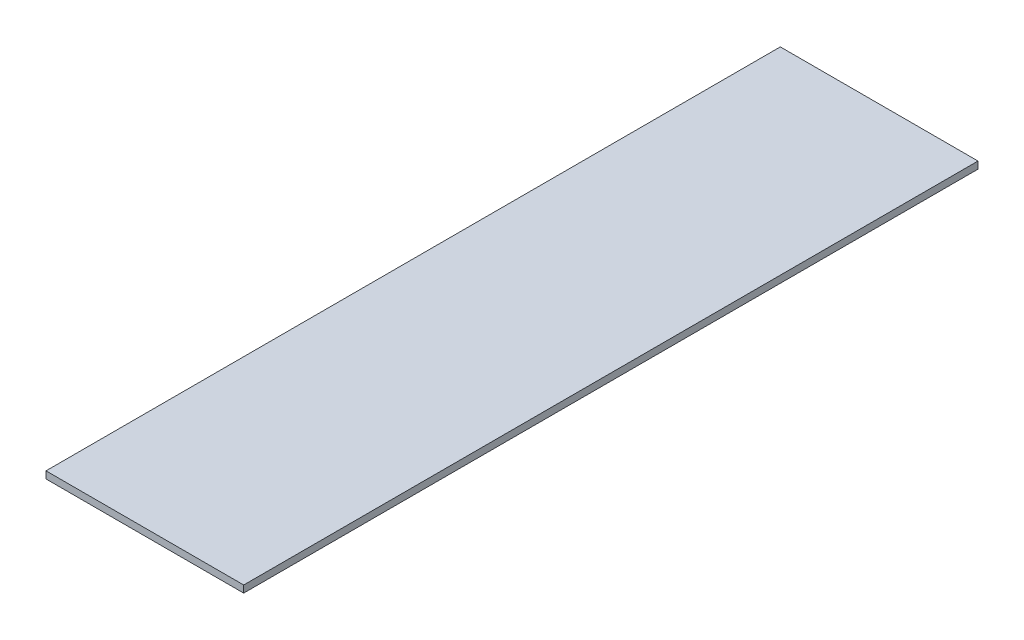
ISO-10303-21;
HEADER;
FILE_DESCRIPTION(('STEP AP214'),'2;1');
FILE_NAME('part.step','',(''),(''),'','','');
FILE_SCHEMA(('AUTOMOTIVE_DESIGN { 1 0 10303 214 1 1 1 1 }'));
ENDSEC;
DATA;
#1=APPLICATION_CONTEXT('core data for automotive mechanical design processes');
#2=APPLICATION_PROTOCOL_DEFINITION('international standard','automotive_design',2000,#1);
#3=PRODUCT_CONTEXT('',#1,'mechanical');
#4=PRODUCT('Part','Part','',(#3));
#5=PRODUCT_RELATED_PRODUCT_CATEGORY('part','',(#4));
#6=PRODUCT_DEFINITION_FORMATION('','',#4);
#7=PRODUCT_DEFINITION_CONTEXT('part definition',#1,'design');
#8=PRODUCT_DEFINITION('design','',#6,#7);
#9=PRODUCT_DEFINITION_SHAPE('','',#8);
#10=(LENGTH_UNIT() NAMED_UNIT(*) SI_UNIT(.MILLI.,.METRE.));
#11=(NAMED_UNIT(*) PLANE_ANGLE_UNIT() SI_UNIT($,.RADIAN.));
#12=(NAMED_UNIT(*) SI_UNIT($,.STERADIAN.) SOLID_ANGLE_UNIT());
#13=UNCERTAINTY_MEASURE_WITH_UNIT(LENGTH_MEASURE(1.E-05),#10,'distance_accuracy_value','');
#14=(GEOMETRIC_REPRESENTATION_CONTEXT(3) GLOBAL_UNCERTAINTY_ASSIGNED_CONTEXT((#13)) GLOBAL_UNIT_ASSIGNED_CONTEXT((#10,
#11,#12)) REPRESENTATION_CONTEXT('',''));
#15=CARTESIAN_POINT('',(0.,0.,0.));
#16=DIRECTION('',(0.,0.,1.));
#17=DIRECTION('',(1.,0.,0.));
#18=AXIS2_PLACEMENT_3D('',#15,#16,#17);
#19=CARTESIAN_POINT('',(-88.9,6.35,-330.2));
#20=DIRECTION('',(1.,0.,0.));
#21=DIRECTION('',(0.,0.,-1.));
#22=AXIS2_PLACEMENT_3D('',#19,#20,#21);
#23=PLANE('',#22);
#24=DIRECTION('',(0.,0.,1.));
#25=VECTOR('',#24,1.);
#26=CARTESIAN_POINT('',(-88.9,0.,-330.2));
#27=LINE('',#26,#25);
#28=CARTESIAN_POINT('',(-88.9,0.,-330.2));
#29=VERTEX_POINT('',#28);
#30=CARTESIAN_POINT('',(-88.8999999999999,0.,330.2));
#31=VERTEX_POINT('',#30);
#32=EDGE_CURVE('E96',#29,#31,#27,.T.);
#33=ORIENTED_EDGE('',*,*,#32,.T.);
#34=DIRECTION('',(0.,-1.,0.));
#35=VECTOR('',#34,1.);
#36=CARTESIAN_POINT('',(-88.8999999999999,6.35,330.2));
#37=LINE('',#36,#35);
#38=CARTESIAN_POINT('',(-88.8999999999999,6.35,330.2));
#39=VERTEX_POINT('',#38);
#40=EDGE_CURVE('E11',#39,#31,#37,.T.);
#41=ORIENTED_EDGE('',*,*,#40,.F.);
#42=DIRECTION('',(0.,0.,1.));
#43=VECTOR('',#42,1.);
#44=CARTESIAN_POINT('',(-88.9,6.35,-330.2));
#45=LINE('',#44,#43);
#46=CARTESIAN_POINT('',(-88.9,6.35,-330.2));
#47=VERTEX_POINT('',#46);
#48=EDGE_CURVE('E84',#47,#39,#45,.T.);
#49=ORIENTED_EDGE('',*,*,#48,.F.);
#50=DIRECTION('',(0.,-1.,0.));
#51=VECTOR('',#50,1.);
#52=CARTESIAN_POINT('',(-88.9,6.35,-330.2));
#53=LINE('',#52,#51);
#54=EDGE_CURVE('E92',#47,#29,#53,.T.);
#55=ORIENTED_EDGE('',*,*,#54,.T.);
#56=EDGE_LOOP('',(#33,#41,#49,#55));
#57=FACE_BOUND('',#56,.T.);
#58=ADVANCED_FACE('F33',(#57),#23,.F.);
#59=CARTESIAN_POINT('',(-88.8999999999999,6.35,330.2));
#60=DIRECTION('',(0.,0.,-1.));
#61=DIRECTION('',(-1.,0.,0.));
#62=AXIS2_PLACEMENT_3D('',#59,#60,#61);
#63=PLANE('',#62);
#64=DIRECTION('',(1.,0.,0.));
#65=VECTOR('',#64,1.);
#66=CARTESIAN_POINT('',(-88.8999999999999,0.,330.2));
#67=LINE('',#66,#65);
#68=CARTESIAN_POINT('',(88.9,0.,330.2));
#69=VERTEX_POINT('',#68);
#70=EDGE_CURVE('E88',#31,#69,#67,.T.);
#71=ORIENTED_EDGE('',*,*,#70,.T.);
#72=DIRECTION('',(0.,-1.,0.));
#73=VECTOR('',#72,1.);
#74=CARTESIAN_POINT('',(88.9,6.35,330.2));
#75=LINE('',#74,#73);
#76=CARTESIAN_POINT('',(88.9,6.35,330.2));
#77=VERTEX_POINT('',#76);
#78=EDGE_CURVE('E41',#77,#69,#75,.T.);
#79=ORIENTED_EDGE('',*,*,#78,.F.);
#80=DIRECTION('',(1.,0.,0.));
#81=VECTOR('',#80,1.);
#82=CARTESIAN_POINT('',(-88.8999999999999,6.35,330.2));
#83=LINE('',#82,#81);
#84=EDGE_CURVE('E79',#39,#77,#83,.T.);
#85=ORIENTED_EDGE('',*,*,#84,.F.);
#86=ORIENTED_EDGE('',*,*,#40,.T.);
#87=EDGE_LOOP('',(#71,#79,#85,#86));
#88=FACE_BOUND('',#87,.T.);
#89=ADVANCED_FACE('F87',(#88),#63,.F.);
#90=CARTESIAN_POINT('',(88.9,6.35,330.2));
#91=DIRECTION('',(-1.,0.,0.));
#92=DIRECTION('',(0.,0.,1.));
#93=AXIS2_PLACEMENT_3D('',#90,#91,#92);
#94=PLANE('',#93);
#95=DIRECTION('',(0.,0.,-1.));
#96=VECTOR('',#95,1.);
#97=CARTESIAN_POINT('',(88.9,0.,330.2));
#98=LINE('',#97,#96);
#99=CARTESIAN_POINT('',(88.9,0.,-330.2));
#100=VERTEX_POINT('',#99);
#101=EDGE_CURVE('E66',#69,#100,#98,.T.);
#102=ORIENTED_EDGE('',*,*,#101,.T.);
#103=DIRECTION('',(0.,-1.,0.));
#104=VECTOR('',#103,1.);
#105=CARTESIAN_POINT('',(88.9,6.35,-330.2));
#106=LINE('',#105,#104);
#107=CARTESIAN_POINT('',(88.9,6.35,-330.2));
#108=VERTEX_POINT('',#107);
#109=EDGE_CURVE('E89',#108,#100,#106,.T.);
#110=ORIENTED_EDGE('',*,*,#109,.F.);
#111=DIRECTION('',(0.,0.,-1.));
#112=VECTOR('',#111,1.);
#113=CARTESIAN_POINT('',(88.9,6.35,330.2));
#114=LINE('',#113,#112);
#115=EDGE_CURVE('E82',#77,#108,#114,.T.);
#116=ORIENTED_EDGE('',*,*,#115,.F.);
#117=ORIENTED_EDGE('',*,*,#78,.T.);
#118=EDGE_LOOP('',(#102,#110,#116,#117));
#119=FACE_BOUND('',#118,.T.);
#120=ADVANCED_FACE('F90',(#119),#94,.F.);
#121=CARTESIAN_POINT('',(88.9,6.35,-330.2));
#122=DIRECTION('',(0.,0.,1.));
#123=DIRECTION('',(1.,0.,0.));
#124=AXIS2_PLACEMENT_3D('',#121,#122,#123);
#125=PLANE('',#124);
#126=DIRECTION('',(-1.,0.,0.));
#127=VECTOR('',#126,1.);
#128=CARTESIAN_POINT('',(88.9,0.,-330.2));
#129=LINE('',#128,#127);
#130=EDGE_CURVE('E72',#100,#29,#129,.T.);
#131=ORIENTED_EDGE('',*,*,#130,.T.);
#132=ORIENTED_EDGE('',*,*,#54,.F.);
#133=DIRECTION('',(-1.,0.,0.));
#134=VECTOR('',#133,1.);
#135=CARTESIAN_POINT('',(88.9,6.35,-330.2));
#136=LINE('',#135,#134);
#137=EDGE_CURVE('E49',#108,#47,#136,.T.);
#138=ORIENTED_EDGE('',*,*,#137,.F.);
#139=ORIENTED_EDGE('',*,*,#109,.T.);
#140=EDGE_LOOP('',(#131,#132,#138,#139));
#141=FACE_BOUND('',#140,.T.);
#142=ADVANCED_FACE('F103',(#141),#125,.F.);
#143=CARTESIAN_POINT('',(0.,6.35,0.));
#144=DIRECTION('',(0.,1.,0.));
#145=DIRECTION('',(0.,0.,1.));
#146=AXIS2_PLACEMENT_3D('',#143,#144,#145);
#147=PLANE('',#146);
#148=ORIENTED_EDGE('',*,*,#48,.T.);
#149=ORIENTED_EDGE('',*,*,#84,.T.);
#150=ORIENTED_EDGE('',*,*,#115,.T.);
#151=ORIENTED_EDGE('',*,*,#137,.T.);
#152=EDGE_LOOP('',(#148,#149,#150,#151));
#153=FACE_BOUND('',#152,.T.);
#154=ADVANCED_FACE('F80',(#153),#147,.T.);
#155=CARTESIAN_POINT('',(0.,0.,0.));
#156=DIRECTION('',(0.,1.,0.));
#157=DIRECTION('',(0.,0.,1.));
#158=AXIS2_PLACEMENT_3D('',#155,#156,#157);
#159=PLANE('',#158);
#160=ORIENTED_EDGE('',*,*,#32,.F.);
#161=ORIENTED_EDGE('',*,*,#130,.F.);
#162=ORIENTED_EDGE('',*,*,#101,.F.);
#163=ORIENTED_EDGE('',*,*,#70,.F.);
#164=EDGE_LOOP('',(#160,#161,#162,#163));
#165=FACE_BOUND('',#164,.T.);
#166=ADVANCED_FACE('F106',(#165),#159,.F.);
#167=CLOSED_SHELL('',(#58,#89,#120,#142,#154,#166));
#168=MANIFOLD_SOLID_BREP('B2',#167);
#169=ADVANCED_BREP_SHAPE_REPRESENTATION('',(#18,#168),#14);
#170=SHAPE_DEFINITION_REPRESENTATION(#9,#169);
ENDSEC;
END-ISO-10303-21;
